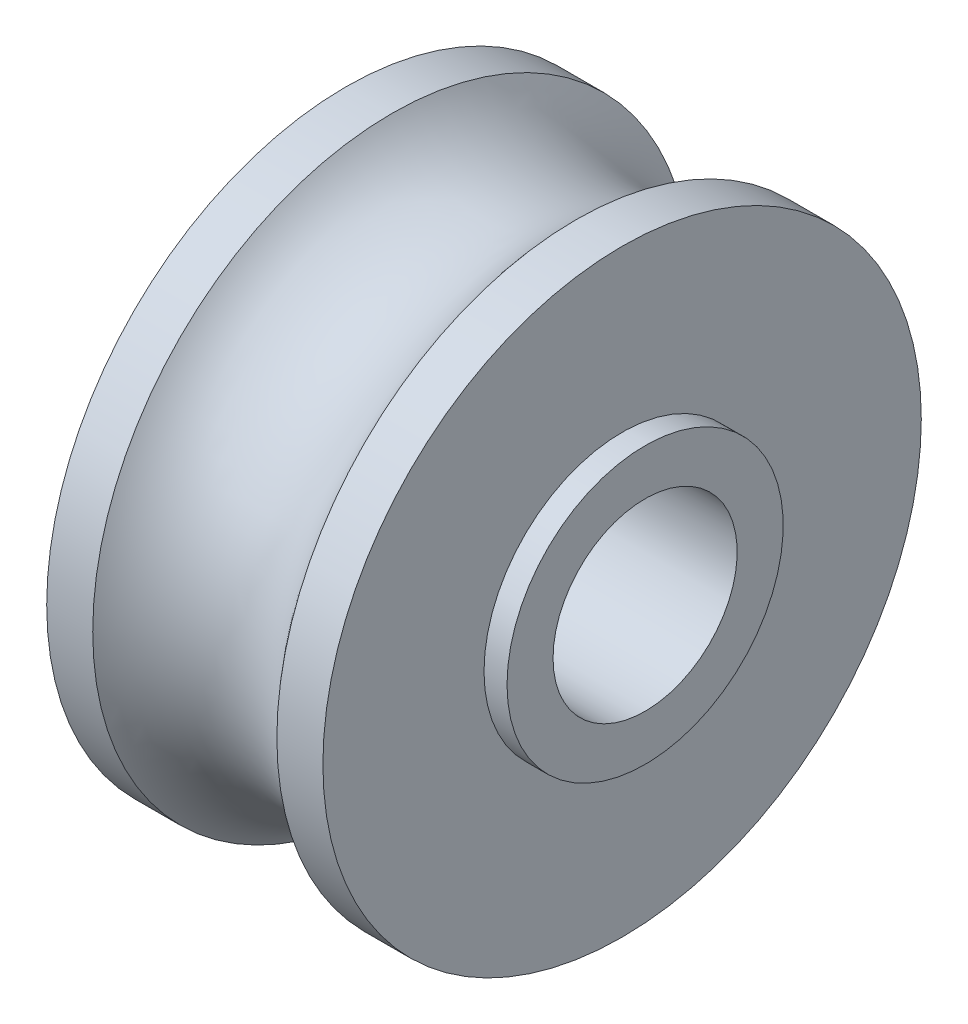
ISO-10303-21;
HEADER;
FILE_DESCRIPTION(('STEP AP214'),'2;1');
FILE_NAME('part.step','',(''),(''),'','','');
FILE_SCHEMA(('AUTOMOTIVE_DESIGN { 1 0 10303 214 1 1 1 1 }'));
ENDSEC;
DATA;
#1=APPLICATION_CONTEXT('core data for automotive mechanical design processes');
#2=APPLICATION_PROTOCOL_DEFINITION('international standard','automotive_design',2000,#1);
#3=PRODUCT_CONTEXT('',#1,'mechanical');
#4=PRODUCT('Part','Part','',(#3));
#5=PRODUCT_RELATED_PRODUCT_CATEGORY('part','',(#4));
#6=PRODUCT_DEFINITION_FORMATION('','',#4);
#7=PRODUCT_DEFINITION_CONTEXT('part definition',#1,'design');
#8=PRODUCT_DEFINITION('design','',#6,#7);
#9=PRODUCT_DEFINITION_SHAPE('','',#8);
#10=(LENGTH_UNIT() NAMED_UNIT(*) SI_UNIT(.MILLI.,.METRE.));
#11=(NAMED_UNIT(*) PLANE_ANGLE_UNIT() SI_UNIT($,.RADIAN.));
#12=(NAMED_UNIT(*) SI_UNIT($,.STERADIAN.) SOLID_ANGLE_UNIT());
#13=UNCERTAINTY_MEASURE_WITH_UNIT(LENGTH_MEASURE(1.E-05),#10,'distance_accuracy_value','');
#14=(GEOMETRIC_REPRESENTATION_CONTEXT(3) GLOBAL_UNCERTAINTY_ASSIGNED_CONTEXT((#13)) GLOBAL_UNIT_ASSIGNED_CONTEXT((#10,
#11,#12)) REPRESENTATION_CONTEXT('',''));
#15=CARTESIAN_POINT('',(0.,0.,0.));
#16=DIRECTION('',(0.,0.,1.));
#17=DIRECTION('',(1.,0.,0.));
#18=AXIS2_PLACEMENT_3D('',#15,#16,#17);
#19=CARTESIAN_POINT('',(3.5,2.,0.));
#20=DIRECTION('',(-1.,0.,0.));
#21=DIRECTION('',(0.,0.,1.));
#22=AXIS2_PLACEMENT_3D('',#19,#20,#21);
#23=PLANE('',#22);
#24=CARTESIAN_POINT('',(3.5,0.,0.));
#25=DIRECTION('',(-1.,0.,0.));
#26=DIRECTION('',(0.,0.,1.));
#27=AXIS2_PLACEMENT_3D('',#24,#25,#26);
#28=CIRCLE('',#27,3.);
#29=CARTESIAN_POINT('',(3.5,0.,3.));
#30=VERTEX_POINT('',#29);
#31=EDGE_CURVE('E10',#30,#30,#28,.T.);
#32=ORIENTED_EDGE('',*,*,#31,.F.);
#33=EDGE_LOOP('',(#32));
#34=FACE_BOUND('',#33,.T.);
#35=CARTESIAN_POINT('',(3.5,0.,0.));
#36=DIRECTION('',(-1.,0.,0.));
#37=DIRECTION('',(0.,0.,1.));
#38=AXIS2_PLACEMENT_3D('',#35,#36,#37);
#39=CIRCLE('',#38,2.);
#40=CARTESIAN_POINT('',(3.5,0.,2.));
#41=VERTEX_POINT('',#40);
#42=EDGE_CURVE('E60',#41,#41,#39,.T.);
#43=ORIENTED_EDGE('',*,*,#42,.T.);
#44=EDGE_LOOP('',(#43));
#45=FACE_BOUND('',#44,.T.);
#46=ADVANCED_FACE('F32',(#34,#45),#23,.F.);
#47=CARTESIAN_POINT('',(0.,0.,0.));
#48=DIRECTION('',(-1.,0.,0.));
#49=DIRECTION('',(0.,0.,1.));
#50=AXIS2_PLACEMENT_3D('',#47,#48,#49);
#51=CYLINDRICAL_SURFACE('',#50,3.);
#52=CARTESIAN_POINT('',(3.,0.,0.));
#53=DIRECTION('',(-1.,0.,0.));
#54=DIRECTION('',(0.,0.,1.));
#55=AXIS2_PLACEMENT_3D('',#52,#53,#54);
#56=CIRCLE('',#55,3.);
#57=CARTESIAN_POINT('',(3.,0.,3.));
#58=VERTEX_POINT('',#57);
#59=EDGE_CURVE('E38',#58,#58,#56,.T.);
#60=ORIENTED_EDGE('',*,*,#59,.F.);
#61=EDGE_LOOP('',(#60));
#62=FACE_BOUND('',#61,.T.);
#63=ORIENTED_EDGE('',*,*,#31,.T.);
#64=EDGE_LOOP('',(#63));
#65=FACE_BOUND('',#64,.T.);
#66=ADVANCED_FACE('F97',(#62,#65),#51,.T.);
#67=CARTESIAN_POINT('',(3.,6.5,0.));
#68=DIRECTION('',(-1.,0.,0.));
#69=DIRECTION('',(0.,0.,1.));
#70=AXIS2_PLACEMENT_3D('',#67,#68,#69);
#71=PLANE('',#70);
#72=CARTESIAN_POINT('',(3.,0.,0.));
#73=DIRECTION('',(-1.,0.,0.));
#74=DIRECTION('',(0.,0.,1.));
#75=AXIS2_PLACEMENT_3D('',#72,#73,#74);
#76=CIRCLE('',#75,6.5);
#77=CARTESIAN_POINT('',(3.,0.,6.5));
#78=VERTEX_POINT('',#77);
#79=EDGE_CURVE('E42',#78,#78,#76,.T.);
#80=ORIENTED_EDGE('',*,*,#79,.F.);
#81=EDGE_LOOP('',(#80));
#82=FACE_BOUND('',#81,.T.);
#83=ORIENTED_EDGE('',*,*,#59,.T.);
#84=EDGE_LOOP('',(#83));
#85=FACE_BOUND('',#84,.T.);
#86=ADVANCED_FACE('F92',(#82,#85),#71,.F.);
#87=CARTESIAN_POINT('',(0.,0.,0.));
#88=DIRECTION('',(-1.,0.,0.));
#89=DIRECTION('',(0.,0.,1.));
#90=AXIS2_PLACEMENT_3D('',#87,#88,#89);
#91=CYLINDRICAL_SURFACE('',#90,6.5);
#92=CARTESIAN_POINT('',(2.,0.,0.));
#93=DIRECTION('',(-1.,0.,0.));
#94=DIRECTION('',(0.,0.,1.));
#95=AXIS2_PLACEMENT_3D('',#92,#93,#94);
#96=CIRCLE('',#95,6.5);
#97=CARTESIAN_POINT('',(2.,0.,6.5));
#98=VERTEX_POINT('',#97);
#99=EDGE_CURVE('E46',#98,#98,#96,.T.);
#100=ORIENTED_EDGE('',*,*,#99,.F.);
#101=EDGE_LOOP('',(#100));
#102=FACE_BOUND('',#101,.T.);
#103=ORIENTED_EDGE('',*,*,#79,.T.);
#104=EDGE_LOOP('',(#103));
#105=FACE_BOUND('',#104,.T.);
#106=ADVANCED_FACE('F86',(#102,#105),#91,.T.);
#107=CARTESIAN_POINT('',(0.,0.,0.));
#108=DIRECTION('',(-1.,0.,0.));
#109=DIRECTION('',(0.,0.,1.));
#110=AXIS2_PLACEMENT_3D('',#107,#108,#109);
#111=TOROIDAL_SURFACE('',#110,8.,2.5);
#112=CARTESIAN_POINT('',(-2.,0.,0.));
#113=DIRECTION('',(-1.,0.,0.));
#114=DIRECTION('',(0.,0.,1.));
#115=AXIS2_PLACEMENT_3D('',#112,#113,#114);
#116=CIRCLE('',#115,6.5);
#117=CARTESIAN_POINT('',(-2.,0.,6.5));
#118=VERTEX_POINT('',#117);
#119=EDGE_CURVE('E51',#118,#118,#116,.T.);
#120=ORIENTED_EDGE('',*,*,#119,.F.);
#121=EDGE_LOOP('',(#120));
#122=FACE_BOUND('',#121,.T.);
#123=ORIENTED_EDGE('',*,*,#99,.T.);
#124=EDGE_LOOP('',(#123));
#125=FACE_BOUND('',#124,.T.);
#126=ADVANCED_FACE('F80',(#122,#125),#111,.F.);
#127=CARTESIAN_POINT('',(0.,0.,0.));
#128=DIRECTION('',(-1.,0.,0.));
#129=DIRECTION('',(0.,0.,1.));
#130=AXIS2_PLACEMENT_3D('',#127,#128,#129);
#131=CYLINDRICAL_SURFACE('',#130,6.5);
#132=CARTESIAN_POINT('',(-3.,0.,0.));
#133=DIRECTION('',(-1.,0.,0.));
#134=DIRECTION('',(0.,0.,1.));
#135=AXIS2_PLACEMENT_3D('',#132,#133,#134);
#136=CIRCLE('',#135,6.5);
#137=CARTESIAN_POINT('',(-3.,0.,6.5));
#138=VERTEX_POINT('',#137);
#139=EDGE_CURVE('E54',#138,#138,#136,.T.);
#140=ORIENTED_EDGE('',*,*,#139,.F.);
#141=EDGE_LOOP('',(#140));
#142=FACE_BOUND('',#141,.T.);
#143=ORIENTED_EDGE('',*,*,#119,.T.);
#144=EDGE_LOOP('',(#143));
#145=FACE_BOUND('',#144,.T.);
#146=ADVANCED_FACE('F74',(#142,#145),#131,.T.);
#147=CARTESIAN_POINT('',(-3.,6.5,0.));
#148=DIRECTION('',(1.,0.,0.));
#149=DIRECTION('',(0.,0.,-1.));
#150=AXIS2_PLACEMENT_3D('',#147,#148,#149);
#151=PLANE('',#150);
#152=CARTESIAN_POINT('',(-3.,0.,0.));
#153=DIRECTION('',(-1.,0.,0.));
#154=DIRECTION('',(0.,0.,1.));
#155=AXIS2_PLACEMENT_3D('',#152,#153,#154);
#156=CIRCLE('',#155,2.);
#157=CARTESIAN_POINT('',(-3.,0.,2.));
#158=VERTEX_POINT('',#157);
#159=EDGE_CURVE('E57',#158,#158,#156,.T.);
#160=ORIENTED_EDGE('',*,*,#159,.F.);
#161=EDGE_LOOP('',(#160));
#162=FACE_BOUND('',#161,.T.);
#163=ORIENTED_EDGE('',*,*,#139,.T.);
#164=EDGE_LOOP('',(#163));
#165=FACE_BOUND('',#164,.T.);
#166=ADVANCED_FACE('F68',(#162,#165),#151,.F.);
#167=CARTESIAN_POINT('',(0.,0.,0.));
#168=DIRECTION('',(-1.,0.,0.));
#169=DIRECTION('',(0.,0.,1.));
#170=AXIS2_PLACEMENT_3D('',#167,#168,#169);
#171=CYLINDRICAL_SURFACE('',#170,2.);
#172=ORIENTED_EDGE('',*,*,#42,.F.);
#173=EDGE_LOOP('',(#172));
#174=FACE_BOUND('',#173,.T.);
#175=ORIENTED_EDGE('',*,*,#159,.T.);
#176=EDGE_LOOP('',(#175));
#177=FACE_BOUND('',#176,.T.);
#178=ADVANCED_FACE('F65',(#174,#177),#171,.F.);
#179=CLOSED_SHELL('',(#46,#66,#86,#106,#126,#146,#166,#178));
#180=MANIFOLD_SOLID_BREP('B2',#179);
#181=ADVANCED_BREP_SHAPE_REPRESENTATION('',(#18,#180),#14);
#182=SHAPE_DEFINITION_REPRESENTATION(#9,#181);
ENDSEC;
END-ISO-10303-21;
